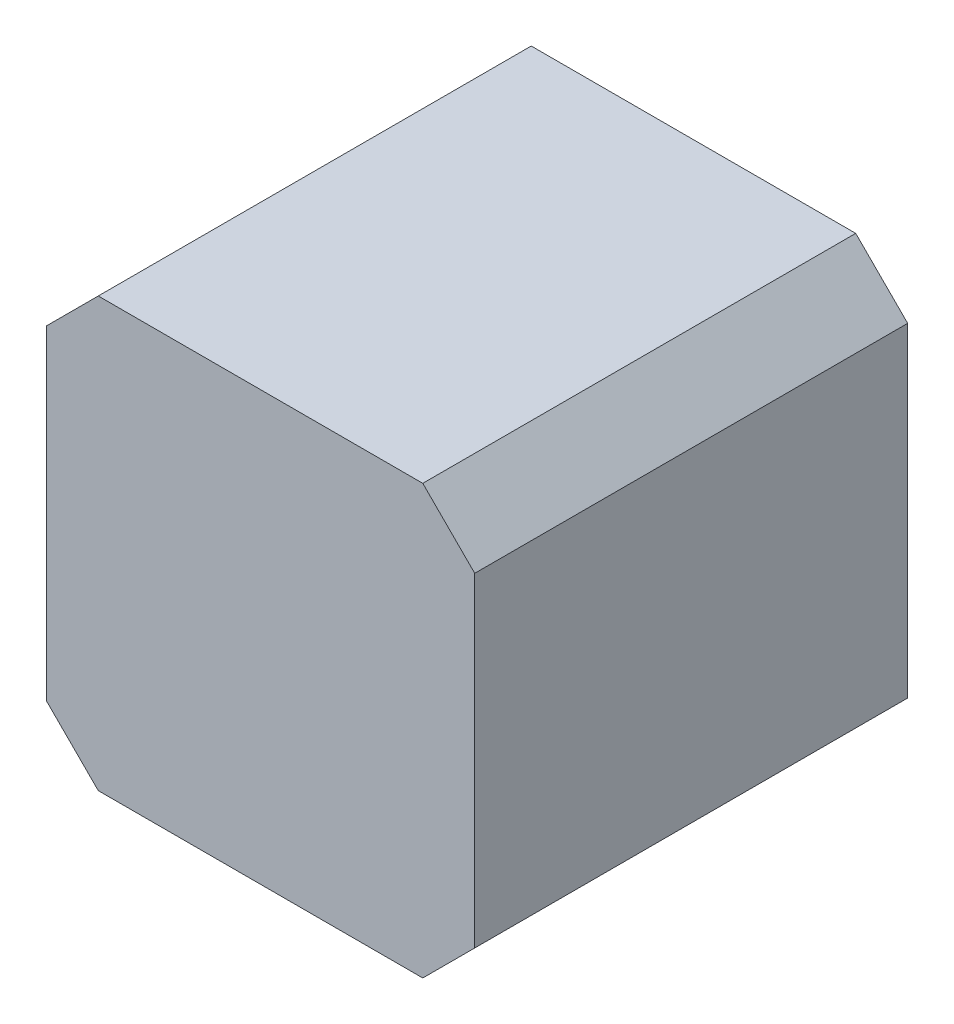
ISO-10303-21;
HEADER;
FILE_DESCRIPTION(('STEP AP214'),'2;1');
FILE_NAME('part.step','',(''),(''),'','','');
FILE_SCHEMA(('AUTOMOTIVE_DESIGN { 1 0 10303 214 1 1 1 1 }'));
ENDSEC;
DATA;
#1=APPLICATION_CONTEXT('core data for automotive mechanical design processes');
#2=APPLICATION_PROTOCOL_DEFINITION('international standard','automotive_design',2000,#1);
#3=PRODUCT_CONTEXT('',#1,'mechanical');
#4=PRODUCT('Part','Part','',(#3));
#5=PRODUCT_RELATED_PRODUCT_CATEGORY('part','',(#4));
#6=PRODUCT_DEFINITION_FORMATION('','',#4);
#7=PRODUCT_DEFINITION_CONTEXT('part definition',#1,'design');
#8=PRODUCT_DEFINITION('design','',#6,#7);
#9=PRODUCT_DEFINITION_SHAPE('','',#8);
#10=(LENGTH_UNIT() NAMED_UNIT(*) SI_UNIT(.MILLI.,.METRE.));
#11=(NAMED_UNIT(*) PLANE_ANGLE_UNIT() SI_UNIT($,.RADIAN.));
#12=(NAMED_UNIT(*) SI_UNIT($,.STERADIAN.) SOLID_ANGLE_UNIT());
#13=UNCERTAINTY_MEASURE_WITH_UNIT(LENGTH_MEASURE(1.E-05),#10,'distance_accuracy_value','');
#14=(GEOMETRIC_REPRESENTATION_CONTEXT(3) GLOBAL_UNCERTAINTY_ASSIGNED_CONTEXT((#13)) GLOBAL_UNIT_ASSIGNED_CONTEXT((#10,
#11,#12)) REPRESENTATION_CONTEXT('',''));
#15=CARTESIAN_POINT('',(0.,0.,0.));
#16=DIRECTION('',(0.,0.,1.));
#17=DIRECTION('',(1.,0.,0.));
#18=AXIS2_PLACEMENT_3D('',#15,#16,#17);
#19=CARTESIAN_POINT('',(-0.0194798895927425,-16.4153005319604,21.6303044782322));
#20=DIRECTION('',(0.707106781186552,0.707106781186543,0.));
#21=DIRECTION('',(0.,0.,-1.));
#22=AXIS2_PLACEMENT_3D('',#19,#20,#21);
#23=PLANE('',#22);
#24=DIRECTION('',(0.707106781186543,-0.707106781186553,0.));
#25=VECTOR('',#24,1.);
#26=CARTESIAN_POINT('',(-0.0194798895927425,-16.4153005319604,21.6303044782322));
#27=LINE('',#26,#25);
#28=CARTESIAN_POINT('',(-0.0194798895927425,-16.4153005341578,21.6303044782322));
#29=VERTEX_POINT('',#28);
#30=CARTESIAN_POINT('',(0.280520117809893,-16.7153005404617,21.6303044782322));
#31=VERTEX_POINT('',#30);
#32=EDGE_CURVE('E102',#29,#31,#27,.T.);
#33=ORIENTED_EDGE('',*,*,#32,.F.);
#34=DIRECTION('',(0.,0.,-1.));
#35=VECTOR('',#34,1.);
#36=CARTESIAN_POINT('',(-0.0194798895927425,-16.4153005363551,21.6303044782322));
#37=LINE('',#36,#35);
#38=CARTESIAN_POINT('',(-0.0194798895927425,-16.4153005330591,19.1303044744322));
#39=VERTEX_POINT('',#38);
#40=EDGE_CURVE('E72',#29,#39,#37,.T.);
#41=ORIENTED_EDGE('',*,*,#40,.T.);
#42=DIRECTION('',(0.707106781186544,-0.707106781186552,0.));
#43=VECTOR('',#42,1.);
#44=CARTESIAN_POINT('',(-0.0194798895927425,-16.4153005319604,19.1303044744322));
#45=LINE('',#44,#43);
#46=CARTESIAN_POINT('',(0.280520119457913,-16.715300541011,19.1303044744322));
#47=VERTEX_POINT('',#46);
#48=EDGE_CURVE('E11',#39,#47,#45,.T.);
#49=ORIENTED_EDGE('',*,*,#48,.T.);
#50=DIRECTION('',(0.,0.,1.));
#51=VECTOR('',#50,1.);
#52=CARTESIAN_POINT('',(0.280520120007253,-16.7153005415604,21.6303044782322));
#53=LINE('',#52,#51);
#54=EDGE_CURVE('E149',#47,#31,#53,.T.);
#55=ORIENTED_EDGE('',*,*,#54,.T.);
#56=EDGE_LOOP('',(#33,#41,#49,#55));
#57=FACE_BOUND('',#56,.T.);
#58=ADVANCED_FACE('F17',(#57),#23,.F.);
#59=CARTESIAN_POINT('',(2.15429485860725,-16.7153005415604,21.6303044782322));
#60=DIRECTION('',(-0.707106781186548,0.707106781186547,0.));
#61=DIRECTION('',(0.,0.,1.));
#62=AXIS2_PLACEMENT_3D('',#59,#60,#61);
#63=PLANE('',#62);
#64=DIRECTION('',(0.707106781186547,0.707106781186548,0.));
#65=VECTOR('',#64,1.);
#66=CARTESIAN_POINT('',(2.15429485860725,-16.7153005415604,21.6303044782322));
#67=LINE('',#66,#65);
#68=CARTESIAN_POINT('',(2.15429486080462,-16.7153005415604,21.6303044782322));
#69=VERTEX_POINT('',#68);
#70=CARTESIAN_POINT('',(2.45429486710858,-16.4153005341578,21.6303044782322));
#71=VERTEX_POINT('',#70);
#72=EDGE_CURVE('E126',#69,#71,#67,.T.);
#73=ORIENTED_EDGE('',*,*,#72,.F.);
#74=DIRECTION('',(0.,0.,-1.));
#75=VECTOR('',#74,1.);
#76=CARTESIAN_POINT('',(2.15429486300198,-16.7153005415604,21.6303044782322));
#77=LINE('',#76,#75);
#78=CARTESIAN_POINT('',(2.15429485970593,-16.7153005415604,19.1303044744322));
#79=VERTEX_POINT('',#78);
#80=EDGE_CURVE('E94',#69,#79,#77,.T.);
#81=ORIENTED_EDGE('',*,*,#80,.T.);
#82=DIRECTION('',(0.707106781186548,0.707106781186548,0.));
#83=VECTOR('',#82,1.);
#84=CARTESIAN_POINT('',(2.15429485860725,-16.7153005415604,19.1303044744322));
#85=LINE('',#84,#83);
#86=CARTESIAN_POINT('',(2.45429486765792,-16.4153005325098,19.1303044744322));
#87=VERTEX_POINT('',#86);
#88=EDGE_CURVE('E27',#79,#87,#85,.T.);
#89=ORIENTED_EDGE('',*,*,#88,.T.);
#90=DIRECTION('',(0.,0.,1.));
#91=VECTOR('',#90,1.);
#92=CARTESIAN_POINT('',(2.45429486820726,-16.4153005319604,19.1303044744322));
#93=LINE('',#92,#91);
#94=EDGE_CURVE('E133',#87,#71,#93,.T.);
#95=ORIENTED_EDGE('',*,*,#94,.T.);
#96=EDGE_LOOP('',(#73,#81,#89,#95));
#97=FACE_BOUND('',#96,.T.);
#98=ADVANCED_FACE('F209',(#97),#63,.F.);
#99=CARTESIAN_POINT('',(-0.0194798895927425,-16.7153005415604,19.1303044744322));
#100=DIRECTION('',(0.,0.,1.));
#101=DIRECTION('',(1.,0.,0.));
#102=AXIS2_PLACEMENT_3D('',#99,#100,#101);
#103=PLANE('',#102);
#104=DIRECTION('',(0.707106781186543,0.707106781186552,0.));
#105=VECTOR('',#104,1.);
#106=CARTESIAN_POINT('',(0.280520120007253,-14.2415257837604,19.1303044744322));
#107=LINE('',#106,#105);
#108=CARTESIAN_POINT('',(-0.0194798890434024,-14.5415257928111,19.1303044744322));
#109=VERTEX_POINT('',#108);
#110=CARTESIAN_POINT('',(0.280520118908573,-14.2415257837604,19.1303044744322));
#111=VERTEX_POINT('',#110);
#112=EDGE_CURVE('E91',#109,#111,#107,.T.);
#113=ORIENTED_EDGE('',*,*,#112,.T.);
#114=DIRECTION('',(1.,0.,0.));
#115=VECTOR('',#114,1.);
#116=CARTESIAN_POINT('',(2.15429485860725,-14.2415257837604,19.1303044744322));
#117=LINE('',#116,#115);
#118=CARTESIAN_POINT('',(2.15429486052995,-14.2415257840351,19.1303044744322));
#119=VERTEX_POINT('',#118);
#120=EDGE_CURVE('E119',#111,#119,#117,.T.);
#121=ORIENTED_EDGE('',*,*,#120,.T.);
#122=DIRECTION('',(0.707106781186547,-0.707106781186548,0.));
#123=VECTOR('',#122,1.);
#124=CARTESIAN_POINT('',(2.45429486820726,-14.5415257933604,19.1303044744322));
#125=LINE('',#124,#123);
#126=CARTESIAN_POINT('',(2.45429486793259,-14.5415257914377,19.1303044744322));
#127=VERTEX_POINT('',#126);
#128=EDGE_CURVE('E135',#119,#127,#125,.T.);
#129=ORIENTED_EDGE('',*,*,#128,.T.);
#130=DIRECTION('',(0.,-1.,0.));
#131=VECTOR('',#130,1.);
#132=CARTESIAN_POINT('',(2.45429486820726,-16.4153005319604,19.1303044744322));
#133=LINE('',#132,#131);
#134=EDGE_CURVE('E152',#127,#87,#133,.T.);
#135=ORIENTED_EDGE('',*,*,#134,.T.);
#136=ORIENTED_EDGE('',*,*,#88,.F.);
#137=DIRECTION('',(-1.,0.,0.));
#138=VECTOR('',#137,1.);
#139=CARTESIAN_POINT('',(2.15429485860725,-16.7153005415604,19.1303044744322));
#140=LINE('',#139,#138);
#141=EDGE_CURVE('E177',#79,#47,#140,.T.);
#142=ORIENTED_EDGE('',*,*,#141,.T.);
#143=ORIENTED_EDGE('',*,*,#48,.F.);
#144=DIRECTION('',(0.,1.,0.));
#145=VECTOR('',#144,1.);
#146=CARTESIAN_POINT('',(-0.0194798895927425,-16.4153005319604,19.1303044744322));
#147=LINE('',#146,#145);
#148=EDGE_CURVE('E93',#39,#109,#147,.T.);
#149=ORIENTED_EDGE('',*,*,#148,.T.);
#150=EDGE_LOOP('',(#113,#121,#129,#135,#136,#142,#143,#149));
#151=FACE_BOUND('',#150,.T.);
#152=ADVANCED_FACE('F211',(#151),#103,.F.);
#153=CARTESIAN_POINT('',(2.45429486820726,-14.5415257933604,21.6303044782322));
#154=DIRECTION('',(-0.707106781186548,-0.707106781186547,0.));
#155=DIRECTION('',(-0.707106781186547,0.707106781186548,0.));
#156=AXIS2_PLACEMENT_3D('',#153,#154,#155);
#157=PLANE('',#156);
#158=DIRECTION('',(-0.707106781186547,0.707106781186548,0.));
#159=VECTOR('',#158,1.);
#160=CARTESIAN_POINT('',(2.45429486820726,-14.5415257933604,21.6303044782322));
#161=LINE('',#160,#159);
#162=CARTESIAN_POINT('',(2.45429486765792,-14.5415257917124,21.6303044782322));
#163=VERTEX_POINT('',#162);
#164=CARTESIAN_POINT('',(2.15429486025528,-14.2415257843097,21.6303044782322));
#165=VERTEX_POINT('',#164);
#166=EDGE_CURVE('E115',#163,#165,#161,.T.);
#167=ORIENTED_EDGE('',*,*,#166,.F.);
#168=DIRECTION('',(0.,0.,-1.));
#169=VECTOR('',#168,1.);
#170=CARTESIAN_POINT('',(2.45429486820726,-14.541525791163,19.1303044744322));
#171=LINE('',#170,#169);
#172=EDGE_CURVE('E163',#163,#127,#171,.T.);
#173=ORIENTED_EDGE('',*,*,#172,.T.);
#174=ORIENTED_EDGE('',*,*,#128,.F.);
#175=DIRECTION('',(0.,0.,1.));
#176=VECTOR('',#175,1.);
#177=CARTESIAN_POINT('',(2.15429486080462,-14.2415257837604,19.1303044744322));
#178=LINE('',#177,#176);
#179=EDGE_CURVE('E123',#119,#165,#178,.T.);
#180=ORIENTED_EDGE('',*,*,#179,.T.);
#181=EDGE_LOOP('',(#167,#173,#174,#180));
#182=FACE_BOUND('',#181,.T.);
#183=ADVANCED_FACE('F218',(#182),#157,.F.);
#184=CARTESIAN_POINT('',(0.280520120007253,-14.2415257837604,21.6303044782322));
#185=DIRECTION('',(0.707106781186552,-0.707106781186543,0.));
#186=DIRECTION('',(0.,0.,-1.));
#187=AXIS2_PLACEMENT_3D('',#184,#185,#186);
#188=PLANE('',#187);
#189=DIRECTION('',(-0.707106781186543,-0.707106781186552,0.));
#190=VECTOR('',#189,1.);
#191=CARTESIAN_POINT('',(0.280520120007253,-14.2415257837604,21.6303044782322));
#192=LINE('',#191,#190);
#193=CARTESIAN_POINT('',(0.280520117809893,-14.2415257837604,21.6303044782322));
#194=VERTEX_POINT('',#193);
#195=CARTESIAN_POINT('',(-0.0194798884940622,-14.541525791163,21.6303044782322));
#196=VERTEX_POINT('',#195);
#197=EDGE_CURVE('E88',#194,#196,#192,.T.);
#198=ORIENTED_EDGE('',*,*,#197,.F.);
#199=DIRECTION('',(0.,0.,-1.));
#200=VECTOR('',#199,1.);
#201=CARTESIAN_POINT('',(0.280520115612533,-14.2415257837604,19.1303044744322));
#202=LINE('',#201,#200);
#203=EDGE_CURVE('E122',#194,#111,#202,.T.);
#204=ORIENTED_EDGE('',*,*,#203,.T.);
#205=ORIENTED_EDGE('',*,*,#112,.F.);
#206=DIRECTION('',(0.,0.,1.));
#207=VECTOR('',#206,1.);
#208=CARTESIAN_POINT('',(-0.0194798895927425,-14.5415257933604,21.6303044782322));
#209=LINE('',#208,#207);
#210=EDGE_CURVE('E85',#109,#196,#209,.T.);
#211=ORIENTED_EDGE('',*,*,#210,.T.);
#212=EDGE_LOOP('',(#198,#204,#205,#211));
#213=FACE_BOUND('',#212,.T.);
#214=ADVANCED_FACE('F19',(#213),#188,.F.);
#215=CARTESIAN_POINT('',(-0.0194798895927425,-16.4153005319604,21.6303044782322));
#216=DIRECTION('',(1.,0.,0.));
#217=DIRECTION('',(0.,1.,0.));
#218=AXIS2_PLACEMENT_3D('',#215,#216,#217);
#219=PLANE('',#218);
#220=DIRECTION('',(0.,-1.,0.));
#221=VECTOR('',#220,1.);
#222=CARTESIAN_POINT('',(-0.0194798895927425,-16.7153005415604,21.6303044782322));
#223=LINE('',#222,#221);
#224=EDGE_CURVE('E97',#196,#29,#223,.T.);
#225=ORIENTED_EDGE('',*,*,#224,.F.);
#226=ORIENTED_EDGE('',*,*,#210,.F.);
#227=ORIENTED_EDGE('',*,*,#148,.F.);
#228=ORIENTED_EDGE('',*,*,#40,.F.);
#229=EDGE_LOOP('',(#225,#226,#227,#228));
#230=FACE_BOUND('',#229,.T.);
#231=ADVANCED_FACE('F98',(#230),#219,.F.);
#232=CARTESIAN_POINT('',(2.15429485860725,-16.7153005415604,21.6303044782322));
#233=DIRECTION('',(0.,1.,0.));
#234=DIRECTION('',(1.,0.,0.));
#235=AXIS2_PLACEMENT_3D('',#232,#233,#234);
#236=PLANE('',#235);
#237=DIRECTION('',(1.,0.,0.));
#238=VECTOR('',#237,1.);
#239=CARTESIAN_POINT('',(-0.0194798895927425,-16.7153005415604,21.6303044782322));
#240=LINE('',#239,#238);
#241=EDGE_CURVE('E131',#31,#69,#240,.T.);
#242=ORIENTED_EDGE('',*,*,#241,.F.);
#243=ORIENTED_EDGE('',*,*,#54,.F.);
#244=ORIENTED_EDGE('',*,*,#141,.F.);
#245=ORIENTED_EDGE('',*,*,#80,.F.);
#246=EDGE_LOOP('',(#242,#243,#244,#245));
#247=FACE_BOUND('',#246,.T.);
#248=ADVANCED_FACE('F207',(#247),#236,.F.);
#249=CARTESIAN_POINT('',(2.45429486820726,-16.4153005319604,19.1303044744322));
#250=DIRECTION('',(-1.,0.,0.));
#251=DIRECTION('',(0.,0.,1.));
#252=AXIS2_PLACEMENT_3D('',#249,#250,#251);
#253=PLANE('',#252);
#254=DIRECTION('',(0.,1.,0.));
#255=VECTOR('',#254,1.);
#256=CARTESIAN_POINT('',(2.45429486820726,-16.7153005415604,21.6303044782322));
#257=LINE('',#256,#255);
#258=EDGE_CURVE('E130',#71,#163,#257,.T.);
#259=ORIENTED_EDGE('',*,*,#258,.F.);
#260=ORIENTED_EDGE('',*,*,#94,.F.);
#261=ORIENTED_EDGE('',*,*,#134,.F.);
#262=ORIENTED_EDGE('',*,*,#172,.F.);
#263=EDGE_LOOP('',(#259,#260,#261,#262));
#264=FACE_BOUND('',#263,.T.);
#265=ADVANCED_FACE('F227',(#264),#253,.F.);
#266=CARTESIAN_POINT('',(2.15429485860725,-14.2415257837604,19.1303044744322));
#267=DIRECTION('',(0.,-1.,0.));
#268=DIRECTION('',(0.,0.,-1.));
#269=AXIS2_PLACEMENT_3D('',#266,#267,#268);
#270=PLANE('',#269);
#271=DIRECTION('',(-1.,0.,0.));
#272=VECTOR('',#271,1.);
#273=CARTESIAN_POINT('',(-0.0194798895927425,-14.2415257837604,21.6303044782322));
#274=LINE('',#273,#272);
#275=EDGE_CURVE('E107',#165,#194,#274,.T.);
#276=ORIENTED_EDGE('',*,*,#275,.F.);
#277=ORIENTED_EDGE('',*,*,#179,.F.);
#278=ORIENTED_EDGE('',*,*,#120,.F.);
#279=ORIENTED_EDGE('',*,*,#203,.F.);
#280=EDGE_LOOP('',(#276,#277,#278,#279));
#281=FACE_BOUND('',#280,.T.);
#282=ADVANCED_FACE('F229',(#281),#270,.F.);
#283=CARTESIAN_POINT('',(-0.0194798895927425,-16.7153005415604,21.6303044782322));
#284=DIRECTION('',(0.,0.,1.));
#285=DIRECTION('',(1.,0.,0.));
#286=AXIS2_PLACEMENT_3D('',#283,#284,#285);
#287=PLANE('',#286);
#288=ORIENTED_EDGE('',*,*,#166,.T.);
#289=ORIENTED_EDGE('',*,*,#275,.T.);
#290=ORIENTED_EDGE('',*,*,#197,.T.);
#291=ORIENTED_EDGE('',*,*,#224,.T.);
#292=ORIENTED_EDGE('',*,*,#32,.T.);
#293=ORIENTED_EDGE('',*,*,#241,.T.);
#294=ORIENTED_EDGE('',*,*,#72,.T.);
#295=ORIENTED_EDGE('',*,*,#258,.T.);
#296=EDGE_LOOP('',(#288,#289,#290,#291,#292,#293,#294,#295));
#297=FACE_BOUND('',#296,.T.);
#298=ADVANCED_FACE('F105',(#297),#287,.T.);
#299=CLOSED_SHELL('',(#58,#98,#152,#183,#214,#231,#248,#265,#282,#298));
#300=MANIFOLD_SOLID_BREP('B1',#299);
#301=ADVANCED_BREP_SHAPE_REPRESENTATION('',(#18,#300),#14);
#302=SHAPE_DEFINITION_REPRESENTATION(#9,#301);
ENDSEC;
END-ISO-10303-21;
